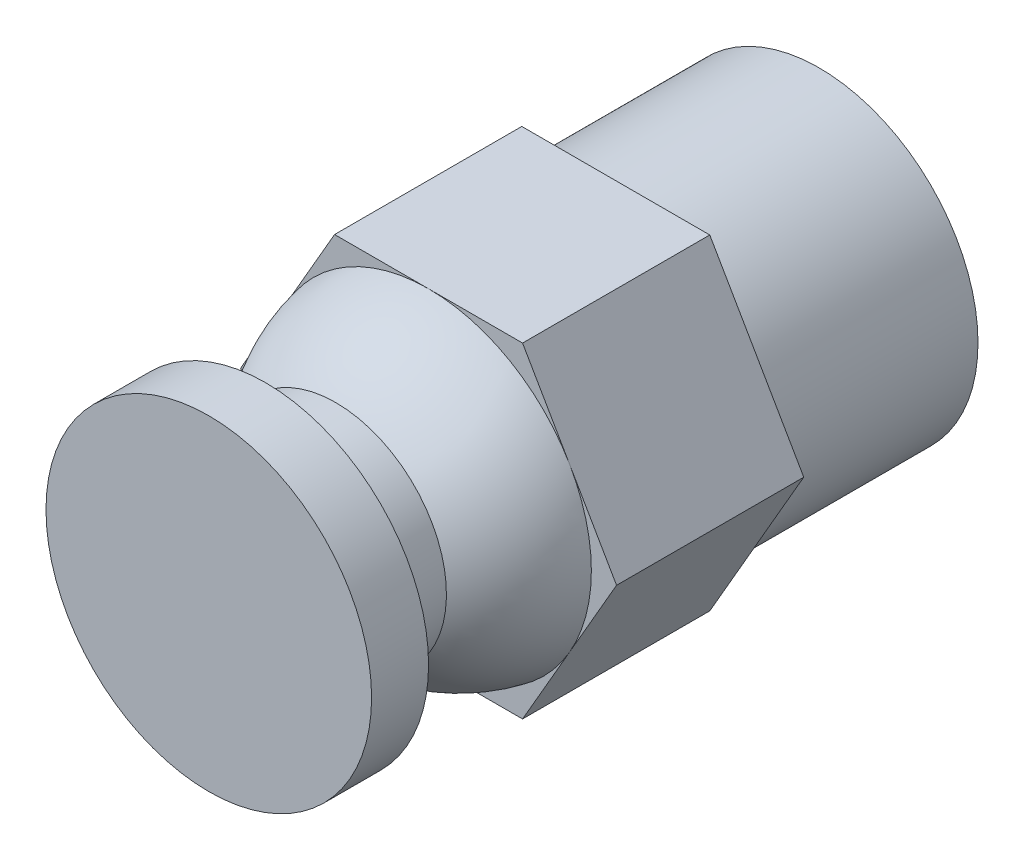
ISO-10303-21;
HEADER;
FILE_DESCRIPTION(('STEP AP214'),'2;1');
FILE_NAME('part.step','',(''),(''),'','','');
FILE_SCHEMA(('AUTOMOTIVE_DESIGN { 1 0 10303 214 1 1 1 1 }'));
ENDSEC;
DATA;
#1=APPLICATION_CONTEXT('core data for automotive mechanical design processes');
#2=APPLICATION_PROTOCOL_DEFINITION('international standard','automotive_design',2000,#1);
#3=PRODUCT_CONTEXT('',#1,'mechanical');
#4=PRODUCT('Part','Part','',(#3));
#5=PRODUCT_RELATED_PRODUCT_CATEGORY('part','',(#4));
#6=PRODUCT_DEFINITION_FORMATION('','',#4);
#7=PRODUCT_DEFINITION_CONTEXT('part definition',#1,'design');
#8=PRODUCT_DEFINITION('design','',#6,#7);
#9=PRODUCT_DEFINITION_SHAPE('','',#8);
#10=(LENGTH_UNIT() NAMED_UNIT(*) SI_UNIT(.MILLI.,.METRE.));
#11=(NAMED_UNIT(*) PLANE_ANGLE_UNIT() SI_UNIT($,.RADIAN.));
#12=(NAMED_UNIT(*) SI_UNIT($,.STERADIAN.) SOLID_ANGLE_UNIT());
#13=UNCERTAINTY_MEASURE_WITH_UNIT(LENGTH_MEASURE(1.E-05),#10,'distance_accuracy_value','');
#14=(GEOMETRIC_REPRESENTATION_CONTEXT(3) GLOBAL_UNCERTAINTY_ASSIGNED_CONTEXT((#13)) GLOBAL_UNIT_ASSIGNED_CONTEXT((#10,
#11,#12)) REPRESENTATION_CONTEXT('',''));
#15=CARTESIAN_POINT('',(0.,0.,0.));
#16=DIRECTION('',(0.,0.,1.));
#17=DIRECTION('',(1.,0.,0.));
#18=AXIS2_PLACEMENT_3D('',#15,#16,#17);
#19=CARTESIAN_POINT('',(0.,0.,12.));
#20=DIRECTION('',(0.,0.,1.));
#21=DIRECTION('',(1.,0.,0.));
#22=AXIS2_PLACEMENT_3D('',#19,#20,#21);
#23=PLANE('',#22);
#24=CARTESIAN_POINT('',(0.,0.,12.));
#25=DIRECTION('',(0.,0.,1.));
#26=DIRECTION('',(1.,0.,0.));
#27=AXIS2_PLACEMENT_3D('',#24,#25,#26);
#28=CIRCLE('',#27,5.);
#29=CARTESIAN_POINT('',(4.3301270189222,2.5,12.));
#30=VERTEX_POINT('',#29);
#31=CARTESIAN_POINT('',(0.,5.,12.));
#32=VERTEX_POINT('',#31);
#33=EDGE_CURVE('E44',#30,#32,#28,.T.);
#34=ORIENTED_EDGE('',*,*,#33,.F.);
#35=DIRECTION('',(-0.5,0.866025403784439,0.));
#36=VECTOR('',#35,1.);
#37=CARTESIAN_POINT('',(5.77350269189626,0.,12.));
#38=LINE('',#37,#36);
#39=CARTESIAN_POINT('',(2.88675134594813,5.,12.));
#40=VERTEX_POINT('',#39);
#41=EDGE_CURVE('E224',#30,#40,#38,.T.);
#42=ORIENTED_EDGE('',*,*,#41,.T.);
#43=DIRECTION('',(-1.,0.,0.));
#44=VECTOR('',#43,1.);
#45=CARTESIAN_POINT('',(2.88675134594813,5.,12.));
#46=LINE('',#45,#44);
#47=EDGE_CURVE('E117',#40,#32,#46,.T.);
#48=ORIENTED_EDGE('',*,*,#47,.T.);
#49=EDGE_LOOP('',(#34,#42,#48));
#50=FACE_BOUND('',#49,.T.);
#51=ADVANCED_FACE('F33',(#50),#23,.T.);
#52=CARTESIAN_POINT('',(-4.3301270189222,2.5,12.));
#53=VERTEX_POINT('',#52);
#54=EDGE_CURVE('E11',#32,#53,#28,.T.);
#55=ORIENTED_EDGE('',*,*,#54,.F.);
#56=CARTESIAN_POINT('',(-2.88675134594813,5.,12.));
#57=VERTEX_POINT('',#56);
#58=EDGE_CURVE('E229',#32,#57,#46,.T.);
#59=ORIENTED_EDGE('',*,*,#58,.T.);
#60=DIRECTION('',(-0.5,-0.866025403784439,0.));
#61=VECTOR('',#60,1.);
#62=CARTESIAN_POINT('',(-2.88675134594813,5.,12.));
#63=LINE('',#62,#61);
#64=EDGE_CURVE('E116',#57,#53,#63,.T.);
#65=ORIENTED_EDGE('',*,*,#64,.T.);
#66=EDGE_LOOP('',(#55,#59,#65));
#67=FACE_BOUND('',#66,.T.);
#68=ADVANCED_FACE('F185',(#67),#23,.T.);
#69=CARTESIAN_POINT('',(-4.3301270189222,-2.5,12.));
#70=VERTEX_POINT('',#69);
#71=EDGE_CURVE('E42',#53,#70,#28,.T.);
#72=ORIENTED_EDGE('',*,*,#71,.F.);
#73=CARTESIAN_POINT('',(-5.77350269189626,0.,12.));
#74=VERTEX_POINT('',#73);
#75=EDGE_CURVE('E108',#53,#74,#63,.T.);
#76=ORIENTED_EDGE('',*,*,#75,.T.);
#77=DIRECTION('',(0.5,-0.866025403784439,0.));
#78=VECTOR('',#77,1.);
#79=CARTESIAN_POINT('',(-5.77350269189626,0.,12.));
#80=LINE('',#79,#78);
#81=EDGE_CURVE('E112',#74,#70,#80,.T.);
#82=ORIENTED_EDGE('',*,*,#81,.T.);
#83=EDGE_LOOP('',(#72,#76,#82));
#84=FACE_BOUND('',#83,.T.);
#85=ADVANCED_FACE('F110',(#84),#23,.T.);
#86=CARTESIAN_POINT('',(0.,-5.,12.));
#87=VERTEX_POINT('',#86);
#88=EDGE_CURVE('E217',#70,#87,#28,.T.);
#89=ORIENTED_EDGE('',*,*,#88,.F.);
#90=CARTESIAN_POINT('',(-2.88675134594813,-5.,12.));
#91=VERTEX_POINT('',#90);
#92=EDGE_CURVE('E133',#70,#91,#80,.T.);
#93=ORIENTED_EDGE('',*,*,#92,.T.);
#94=DIRECTION('',(1.,0.,0.));
#95=VECTOR('',#94,1.);
#96=CARTESIAN_POINT('',(-2.88675134594813,-5.,12.));
#97=LINE('',#96,#95);
#98=EDGE_CURVE('E135',#91,#87,#97,.T.);
#99=ORIENTED_EDGE('',*,*,#98,.T.);
#100=EDGE_LOOP('',(#89,#93,#99));
#101=FACE_BOUND('',#100,.T.);
#102=ADVANCED_FACE('F206',(#101),#23,.T.);
#103=CARTESIAN_POINT('',(4.33012701892219,-2.5,12.));
#104=VERTEX_POINT('',#103);
#105=EDGE_CURVE('E167',#87,#104,#28,.T.);
#106=ORIENTED_EDGE('',*,*,#105,.F.);
#107=CARTESIAN_POINT('',(2.88675134594813,-5.,12.));
#108=VERTEX_POINT('',#107);
#109=EDGE_CURVE('E58',#87,#108,#97,.T.);
#110=ORIENTED_EDGE('',*,*,#109,.T.);
#111=DIRECTION('',(0.5,0.866025403784438,0.));
#112=VECTOR('',#111,1.);
#113=CARTESIAN_POINT('',(2.88675134594813,-5.,12.));
#114=LINE('',#113,#112);
#115=EDGE_CURVE('E215',#108,#104,#114,.T.);
#116=ORIENTED_EDGE('',*,*,#115,.T.);
#117=EDGE_LOOP('',(#106,#110,#116));
#118=FACE_BOUND('',#117,.T.);
#119=ADVANCED_FACE('F182',(#118),#23,.T.);
#120=CARTESIAN_POINT('',(0.,0.,6.25));
#121=DIRECTION('',(0.,0.,-1.));
#122=DIRECTION('',(-1.,0.,0.));
#123=AXIS2_PLACEMENT_3D('',#120,#121,#122);
#124=CYLINDRICAL_SURFACE('',#123,4.875);
#125=CARTESIAN_POINT('',(0.,0.,6.25));
#126=DIRECTION('',(0.,0.,1.));
#127=DIRECTION('',(1.,0.,0.));
#128=AXIS2_PLACEMENT_3D('',#125,#126,#127);
#129=CIRCLE('',#128,4.875);
#130=CARTESIAN_POINT('',(4.875,0.,6.25));
#131=VERTEX_POINT('',#130);
#132=EDGE_CURVE('E161',#131,#131,#129,.T.);
#133=ORIENTED_EDGE('',*,*,#132,.F.);
#134=EDGE_LOOP('',(#133));
#135=FACE_BOUND('',#134,.T.);
#136=CARTESIAN_POINT('',(0.,0.,0.));
#137=DIRECTION('',(0.,0.,1.));
#138=DIRECTION('',(1.,0.,0.));
#139=AXIS2_PLACEMENT_3D('',#136,#137,#138);
#140=CIRCLE('',#139,4.875);
#141=CARTESIAN_POINT('',(4.875,0.,0.));
#142=VERTEX_POINT('',#141);
#143=EDGE_CURVE('E37',#142,#142,#140,.T.);
#144=ORIENTED_EDGE('',*,*,#143,.T.);
#145=EDGE_LOOP('',(#144));
#146=FACE_BOUND('',#145,.T.);
#147=ADVANCED_FACE('F35',(#135,#146),#124,.T.);
#148=CARTESIAN_POINT('',(0.,0.,0.));
#149=DIRECTION('',(0.,0.,1.));
#150=DIRECTION('',(1.,0.,0.));
#151=AXIS2_PLACEMENT_3D('',#148,#149,#150);
#152=PLANE('',#151);
#153=ORIENTED_EDGE('',*,*,#143,.F.);
#154=EDGE_LOOP('',(#153));
#155=FACE_BOUND('',#154,.T.);
#156=ADVANCED_FACE('F172',(#155),#152,.F.);
#157=CARTESIAN_POINT('',(2.88675134594813,-5.,12.));
#158=DIRECTION('',(-0.866025403784439,0.5,0.));
#159=DIRECTION('',(-0.5,-0.866025403784438,0.));
#160=AXIS2_PLACEMENT_3D('',#157,#158,#159);
#161=PLANE('',#160);
#162=DIRECTION('',(0.5,0.866025403784438,0.));
#163=VECTOR('',#162,1.);
#164=CARTESIAN_POINT('',(2.88675134594813,-5.,6.25));
#165=LINE('',#164,#163);
#166=CARTESIAN_POINT('',(2.88675134594813,-5.,6.25));
#167=VERTEX_POINT('',#166);
#168=CARTESIAN_POINT('',(5.77350269189626,0.,6.25));
#169=VERTEX_POINT('',#168);
#170=EDGE_CURVE('E141',#167,#169,#165,.T.);
#171=ORIENTED_EDGE('',*,*,#170,.T.);
#172=DIRECTION('',(0.,0.,-1.));
#173=VECTOR('',#172,1.);
#174=CARTESIAN_POINT('',(5.77350269189626,0.,12.));
#175=LINE('',#174,#173);
#176=CARTESIAN_POINT('',(5.77350269189626,0.,12.));
#177=VERTEX_POINT('',#176);
#178=EDGE_CURVE('E159',#177,#169,#175,.T.);
#179=ORIENTED_EDGE('',*,*,#178,.F.);
#180=EDGE_CURVE('E95',#104,#177,#114,.T.);
#181=ORIENTED_EDGE('',*,*,#180,.F.);
#182=ORIENTED_EDGE('',*,*,#115,.F.);
#183=DIRECTION('',(0.,0.,-1.));
#184=VECTOR('',#183,1.);
#185=CARTESIAN_POINT('',(2.88675134594813,-5.,12.));
#186=LINE('',#185,#184);
#187=EDGE_CURVE('E140',#108,#167,#186,.T.);
#188=ORIENTED_EDGE('',*,*,#187,.T.);
#189=EDGE_LOOP('',(#171,#179,#181,#182,#188));
#190=FACE_BOUND('',#189,.T.);
#191=ADVANCED_FACE('F174',(#190),#161,.F.);
#192=CARTESIAN_POINT('',(5.77350269189626,0.,12.));
#193=DIRECTION('',(-0.866025403784439,-0.5,0.));
#194=DIRECTION('',(0.5,-0.866025403784439,0.));
#195=AXIS2_PLACEMENT_3D('',#192,#193,#194);
#196=PLANE('',#195);
#197=DIRECTION('',(-0.5,0.866025403784439,0.));
#198=VECTOR('',#197,1.);
#199=CARTESIAN_POINT('',(5.77350269189626,0.,6.25));
#200=LINE('',#199,#198);
#201=CARTESIAN_POINT('',(2.88675134594813,5.,6.25));
#202=VERTEX_POINT('',#201);
#203=EDGE_CURVE('E144',#169,#202,#200,.T.);
#204=ORIENTED_EDGE('',*,*,#203,.T.);
#205=DIRECTION('',(0.,0.,-1.));
#206=VECTOR('',#205,1.);
#207=CARTESIAN_POINT('',(2.88675134594813,5.,12.));
#208=LINE('',#207,#206);
#209=EDGE_CURVE('E156',#40,#202,#208,.T.);
#210=ORIENTED_EDGE('',*,*,#209,.F.);
#211=ORIENTED_EDGE('',*,*,#41,.F.);
#212=EDGE_CURVE('E226',#177,#30,#38,.T.);
#213=ORIENTED_EDGE('',*,*,#212,.F.);
#214=ORIENTED_EDGE('',*,*,#178,.T.);
#215=EDGE_LOOP('',(#204,#210,#211,#213,#214));
#216=FACE_BOUND('',#215,.T.);
#217=ADVANCED_FACE('F179',(#216),#196,.F.);
#218=CARTESIAN_POINT('',(2.88675134594813,5.,12.));
#219=DIRECTION('',(0.,-1.,0.));
#220=DIRECTION('',(1.,0.,0.));
#221=AXIS2_PLACEMENT_3D('',#218,#219,#220);
#222=PLANE('',#221);
#223=DIRECTION('',(-1.,0.,0.));
#224=VECTOR('',#223,1.);
#225=CARTESIAN_POINT('',(2.88675134594813,5.,6.25));
#226=LINE('',#225,#224);
#227=CARTESIAN_POINT('',(-2.88675134594813,5.,6.25));
#228=VERTEX_POINT('',#227);
#229=EDGE_CURVE('E147',#202,#228,#226,.T.);
#230=ORIENTED_EDGE('',*,*,#229,.T.);
#231=DIRECTION('',(0.,0.,-1.));
#232=VECTOR('',#231,1.);
#233=CARTESIAN_POINT('',(-2.88675134594813,5.,12.));
#234=LINE('',#233,#232);
#235=EDGE_CURVE('E127',#57,#228,#234,.T.);
#236=ORIENTED_EDGE('',*,*,#235,.F.);
#237=ORIENTED_EDGE('',*,*,#58,.F.);
#238=ORIENTED_EDGE('',*,*,#47,.F.);
#239=ORIENTED_EDGE('',*,*,#209,.T.);
#240=EDGE_LOOP('',(#230,#236,#237,#238,#239));
#241=FACE_BOUND('',#240,.T.);
#242=ADVANCED_FACE('F236',(#241),#222,.F.);
#243=CARTESIAN_POINT('',(-2.88675134594813,5.,12.));
#244=DIRECTION('',(0.866025403784439,-0.5,0.));
#245=DIRECTION('',(0.5,0.866025403784439,0.));
#246=AXIS2_PLACEMENT_3D('',#243,#244,#245);
#247=PLANE('',#246);
#248=DIRECTION('',(-0.5,-0.866025403784439,0.));
#249=VECTOR('',#248,1.);
#250=CARTESIAN_POINT('',(-2.88675134594813,5.,6.25));
#251=LINE('',#250,#249);
#252=CARTESIAN_POINT('',(-5.77350269189626,0.,6.25));
#253=VERTEX_POINT('',#252);
#254=EDGE_CURVE('E124',#228,#253,#251,.T.);
#255=ORIENTED_EDGE('',*,*,#254,.T.);
#256=DIRECTION('',(0.,0.,-1.));
#257=VECTOR('',#256,1.);
#258=CARTESIAN_POINT('',(-5.77350269189626,0.,12.));
#259=LINE('',#258,#257);
#260=EDGE_CURVE('E120',#74,#253,#259,.T.);
#261=ORIENTED_EDGE('',*,*,#260,.F.);
#262=ORIENTED_EDGE('',*,*,#75,.F.);
#263=ORIENTED_EDGE('',*,*,#64,.F.);
#264=ORIENTED_EDGE('',*,*,#235,.T.);
#265=EDGE_LOOP('',(#255,#261,#262,#263,#264));
#266=FACE_BOUND('',#265,.T.);
#267=ADVANCED_FACE('F121',(#266),#247,.F.);
#268=CARTESIAN_POINT('',(-5.77350269189626,0.,12.));
#269=DIRECTION('',(0.866025403784439,0.5,0.));
#270=DIRECTION('',(-0.5,0.866025403784439,0.));
#271=AXIS2_PLACEMENT_3D('',#268,#269,#270);
#272=PLANE('',#271);
#273=DIRECTION('',(0.5,-0.866025403784439,0.));
#274=VECTOR('',#273,1.);
#275=CARTESIAN_POINT('',(-5.77350269189626,0.,6.25));
#276=LINE('',#275,#274);
#277=CARTESIAN_POINT('',(-2.88675134594813,-5.,6.25));
#278=VERTEX_POINT('',#277);
#279=EDGE_CURVE('E150',#253,#278,#276,.T.);
#280=ORIENTED_EDGE('',*,*,#279,.T.);
#281=DIRECTION('',(0.,0.,-1.));
#282=VECTOR('',#281,1.);
#283=CARTESIAN_POINT('',(-2.88675134594813,-5.,12.));
#284=LINE('',#283,#282);
#285=EDGE_CURVE('E128',#91,#278,#284,.T.);
#286=ORIENTED_EDGE('',*,*,#285,.F.);
#287=ORIENTED_EDGE('',*,*,#92,.F.);
#288=ORIENTED_EDGE('',*,*,#81,.F.);
#289=ORIENTED_EDGE('',*,*,#260,.T.);
#290=EDGE_LOOP('',(#280,#286,#287,#288,#289));
#291=FACE_BOUND('',#290,.T.);
#292=ADVANCED_FACE('F131',(#291),#272,.F.);
#293=CARTESIAN_POINT('',(-2.88675134594813,-5.,12.));
#294=DIRECTION('',(0.,1.,0.));
#295=DIRECTION('',(-1.,0.,0.));
#296=AXIS2_PLACEMENT_3D('',#293,#294,#295);
#297=PLANE('',#296);
#298=DIRECTION('',(1.,0.,0.));
#299=VECTOR('',#298,1.);
#300=CARTESIAN_POINT('',(-2.88675134594813,-5.,6.25));
#301=LINE('',#300,#299);
#302=EDGE_CURVE('E86',#278,#167,#301,.T.);
#303=ORIENTED_EDGE('',*,*,#302,.T.);
#304=ORIENTED_EDGE('',*,*,#187,.F.);
#305=ORIENTED_EDGE('',*,*,#109,.F.);
#306=ORIENTED_EDGE('',*,*,#98,.F.);
#307=ORIENTED_EDGE('',*,*,#285,.T.);
#308=EDGE_LOOP('',(#303,#304,#305,#306,#307));
#309=FACE_BOUND('',#308,.T.);
#310=ADVANCED_FACE('F198',(#309),#297,.F.);
#311=EDGE_CURVE('E163',#104,#30,#28,.T.);
#312=ORIENTED_EDGE('',*,*,#311,.F.);
#313=ORIENTED_EDGE('',*,*,#180,.T.);
#314=ORIENTED_EDGE('',*,*,#212,.T.);
#315=EDGE_LOOP('',(#312,#313,#314));
#316=FACE_BOUND('',#315,.T.);
#317=ADVANCED_FACE('F188',(#316),#23,.T.);
#318=CARTESIAN_POINT('',(0.,0.,6.25));
#319=DIRECTION('',(0.,0.,1.));
#320=DIRECTION('',(1.,0.,0.));
#321=AXIS2_PLACEMENT_3D('',#318,#319,#320);
#322=PLANE('',#321);
#323=ORIENTED_EDGE('',*,*,#132,.T.);
#324=EDGE_LOOP('',(#323));
#325=FACE_BOUND('',#324,.T.);
#326=ORIENTED_EDGE('',*,*,#170,.F.);
#327=ORIENTED_EDGE('',*,*,#302,.F.);
#328=ORIENTED_EDGE('',*,*,#279,.F.);
#329=ORIENTED_EDGE('',*,*,#254,.F.);
#330=ORIENTED_EDGE('',*,*,#229,.F.);
#331=ORIENTED_EDGE('',*,*,#203,.F.);
#332=EDGE_LOOP('',(#326,#327,#328,#329,#330,#331));
#333=FACE_BOUND('',#332,.T.);
#334=ADVANCED_FACE('F197',(#325,#333),#322,.F.);
#335=CARTESIAN_POINT('',(0.,0.,11.0683698654113));
#336=DIRECTION('',(0.,0.,-1.));
#337=DIRECTION('',(0.,1.,0.));
#338=AXIS2_PLACEMENT_3D('',#335,#336,#337);
#339=SPHERICAL_SURFACE('',#338,5.08605295958209);
#340=ORIENTED_EDGE('',*,*,#33,.T.);
#341=ORIENTED_EDGE('',*,*,#54,.T.);
#342=ORIENTED_EDGE('',*,*,#71,.T.);
#343=ORIENTED_EDGE('',*,*,#88,.T.);
#344=ORIENTED_EDGE('',*,*,#105,.T.);
#345=ORIENTED_EDGE('',*,*,#311,.T.);
#346=EDGE_LOOP('',(#340,#341,#342,#343,#344,#345));
#347=FACE_BOUND('',#346,.T.);
#348=CARTESIAN_POINT('',(0.,0.,14.8509529388776));
#349=DIRECTION('',(0.,0.,-1.));
#350=DIRECTION('',(0.,1.,0.));
#351=AXIS2_PLACEMENT_3D('',#348,#349,#350);
#352=CIRCLE('',#351,3.4);
#353=CARTESIAN_POINT('',(0.,3.4,14.8509529388776));
#354=VERTEX_POINT('',#353);
#355=EDGE_CURVE('E253',#354,#354,#352,.T.);
#356=ORIENTED_EDGE('',*,*,#355,.T.);
#357=EDGE_LOOP('',(#356));
#358=FACE_BOUND('',#357,.T.);
#359=ADVANCED_FACE('F203',(#347,#358),#339,.T.);
#360=CARTESIAN_POINT('',(0.,5.,17.));
#361=DIRECTION('',(0.,0.,1.));
#362=DIRECTION('',(0.,-1.,0.));
#363=AXIS2_PLACEMENT_3D('',#360,#361,#362);
#364=PLANE('',#363);
#365=CARTESIAN_POINT('',(0.,0.,17.));
#366=DIRECTION('',(0.,0.,-1.));
#367=DIRECTION('',(0.,1.,0.));
#368=AXIS2_PLACEMENT_3D('',#365,#366,#367);
#369=CIRCLE('',#368,3.4);
#370=CARTESIAN_POINT('',(0.,3.4,17.));
#371=VERTEX_POINT('',#370);
#372=EDGE_CURVE('E248',#371,#371,#369,.T.);
#373=ORIENTED_EDGE('',*,*,#372,.F.);
#374=EDGE_LOOP('',(#373));
#375=FACE_BOUND('',#374,.T.);
#376=CARTESIAN_POINT('',(0.,0.,17.));
#377=DIRECTION('',(0.,0.,-1.));
#378=DIRECTION('',(0.,1.,0.));
#379=AXIS2_PLACEMENT_3D('',#376,#377,#378);
#380=CIRCLE('',#379,5.);
#381=CARTESIAN_POINT('',(0.,5.,17.));
#382=VERTEX_POINT('',#381);
#383=EDGE_CURVE('E245',#382,#382,#380,.T.);
#384=ORIENTED_EDGE('',*,*,#383,.T.);
#385=EDGE_LOOP('',(#384));
#386=FACE_BOUND('',#385,.T.);
#387=ADVANCED_FACE('F263',(#375,#386),#364,.F.);
#388=CARTESIAN_POINT('',(0.,0.,12.));
#389=DIRECTION('',(0.,0.,-1.));
#390=DIRECTION('',(0.,1.,0.));
#391=AXIS2_PLACEMENT_3D('',#388,#389,#390);
#392=CYLINDRICAL_SURFACE('',#391,3.4);
#393=ORIENTED_EDGE('',*,*,#355,.F.);
#394=EDGE_LOOP('',(#393));
#395=FACE_BOUND('',#394,.T.);
#396=ORIENTED_EDGE('',*,*,#372,.T.);
#397=EDGE_LOOP('',(#396));
#398=FACE_BOUND('',#397,.T.);
#399=ADVANCED_FACE('F259',(#395,#398),#392,.T.);
#400=CARTESIAN_POINT('',(0.,0.,18.75));
#401=DIRECTION('',(0.,0.,1.));
#402=DIRECTION('',(1.,0.,0.));
#403=AXIS2_PLACEMENT_3D('',#400,#401,#402);
#404=PLANE('',#403);
#405=CARTESIAN_POINT('',(0.,0.,18.75));
#406=DIRECTION('',(0.,0.,1.));
#407=DIRECTION('',(1.,0.,0.));
#408=AXIS2_PLACEMENT_3D('',#405,#406,#407);
#409=CIRCLE('',#408,5.);
#410=CARTESIAN_POINT('',(5.,0.,18.75));
#411=VERTEX_POINT('',#410);
#412=EDGE_CURVE('E145',#411,#411,#409,.T.);
#413=ORIENTED_EDGE('',*,*,#412,.T.);
#414=EDGE_LOOP('',(#413));
#415=FACE_BOUND('',#414,.T.);
#416=ADVANCED_FACE('F262',(#415),#404,.T.);
#417=CARTESIAN_POINT('',(0.,0.,18.75));
#418=DIRECTION('',(0.,0.,-1.));
#419=DIRECTION('',(-1.,0.,0.));
#420=AXIS2_PLACEMENT_3D('',#417,#418,#419);
#421=CYLINDRICAL_SURFACE('',#420,5.);
#422=ORIENTED_EDGE('',*,*,#383,.F.);
#423=EDGE_LOOP('',(#422));
#424=FACE_BOUND('',#423,.T.);
#425=ORIENTED_EDGE('',*,*,#412,.F.);
#426=EDGE_LOOP('',(#425));
#427=FACE_BOUND('',#426,.T.);
#428=ADVANCED_FACE('F275',(#424,#427),#421,.T.);
#429=CLOSED_SHELL('',(#51,#68,#85,#102,#119,#147,#156,#191,#217,#242,#267,#292,#310,#317,#334,
#359,#387,#399,#416,#428));
#430=MANIFOLD_SOLID_BREP('B2',#429);
#431=ADVANCED_BREP_SHAPE_REPRESENTATION('',(#18,#430),#14);
#432=SHAPE_DEFINITION_REPRESENTATION(#9,#431);
ENDSEC;
END-ISO-10303-21;
